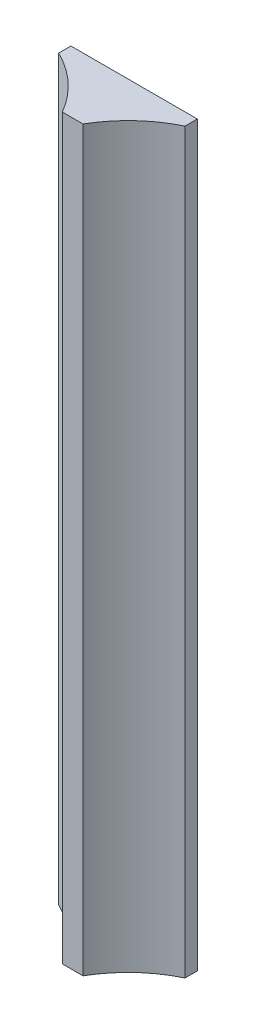
ISO-10303-21;
HEADER;
FILE_DESCRIPTION(('STEP AP214'),'2;1');
FILE_NAME('part.step','',(''),(''),'','','');
FILE_SCHEMA(('AUTOMOTIVE_DESIGN { 1 0 10303 214 1 1 1 1 }'));
ENDSEC;
DATA;
#1=APPLICATION_CONTEXT('core data for automotive mechanical design processes');
#2=APPLICATION_PROTOCOL_DEFINITION('international standard','automotive_design',2000,#1);
#3=PRODUCT_CONTEXT('',#1,'mechanical');
#4=PRODUCT('Part','Part','',(#3));
#5=PRODUCT_RELATED_PRODUCT_CATEGORY('part','',(#4));
#6=PRODUCT_DEFINITION_FORMATION('','',#4);
#7=PRODUCT_DEFINITION_CONTEXT('part definition',#1,'design');
#8=PRODUCT_DEFINITION('design','',#6,#7);
#9=PRODUCT_DEFINITION_SHAPE('','',#8);
#10=(LENGTH_UNIT() NAMED_UNIT(*) SI_UNIT(.MILLI.,.METRE.));
#11=(NAMED_UNIT(*) PLANE_ANGLE_UNIT() SI_UNIT($,.RADIAN.));
#12=(NAMED_UNIT(*) SI_UNIT($,.STERADIAN.) SOLID_ANGLE_UNIT());
#13=UNCERTAINTY_MEASURE_WITH_UNIT(LENGTH_MEASURE(1.E-05),#10,'distance_accuracy_value','');
#14=(GEOMETRIC_REPRESENTATION_CONTEXT(3) GLOBAL_UNCERTAINTY_ASSIGNED_CONTEXT((#13)) GLOBAL_UNIT_ASSIGNED_CONTEXT((#10,
#11,#12)) REPRESENTATION_CONTEXT('',''));
#15=CARTESIAN_POINT('',(0.,0.,0.));
#16=DIRECTION('',(0.,0.,1.));
#17=DIRECTION('',(1.,0.,0.));
#18=AXIS2_PLACEMENT_3D('',#15,#16,#17);
#19=CARTESIAN_POINT('',(-9.5,30.,5.));
#20=DIRECTION('',(0.,-1.,0.));
#21=DIRECTION('',(0.,0.,-1.));
#22=AXIS2_PLACEMENT_3D('',#19,#20,#21);
#23=CYLINDRICAL_SURFACE('',#22,10.);
#24=CARTESIAN_POINT('',(-9.5,-30.,5.));
#25=DIRECTION('',(0.,-1.,0.));
#26=DIRECTION('',(0.,0.,-1.));
#27=AXIS2_PLACEMENT_3D('',#24,#25,#26);
#28=CIRCLE('',#27,10.);
#29=CARTESIAN_POINT('',(-5.14110105645933,-30.,-4.));
#30=VERTEX_POINT('',#29);
#31=CARTESIAN_POINT('',(-0.839745962155612,-30.,0.));
#32=VERTEX_POINT('',#31);
#33=EDGE_CURVE('E128',#30,#32,#28,.T.);
#34=ORIENTED_EDGE('',*,*,#33,.T.);
#35=DIRECTION('',(0.,-1.,0.));
#36=VECTOR('',#35,1.);
#37=CARTESIAN_POINT('',(-0.839745962155612,30.,0.));
#38=LINE('',#37,#36);
#39=CARTESIAN_POINT('',(-0.839745962155612,30.,0.));
#40=VERTEX_POINT('',#39);
#41=EDGE_CURVE('E11',#40,#32,#38,.T.);
#42=ORIENTED_EDGE('',*,*,#41,.F.);
#43=CARTESIAN_POINT('',(-9.5,30.,5.));
#44=DIRECTION('',(0.,-1.,0.));
#45=DIRECTION('',(0.,0.,-1.));
#46=AXIS2_PLACEMENT_3D('',#43,#44,#45);
#47=CIRCLE('',#46,10.);
#48=CARTESIAN_POINT('',(-5.14110105645933,30.,-4.));
#49=VERTEX_POINT('',#48);
#50=EDGE_CURVE('E144',#49,#40,#47,.T.);
#51=ORIENTED_EDGE('',*,*,#50,.F.);
#52=DIRECTION('',(0.,-1.,0.));
#53=VECTOR('',#52,1.);
#54=CARTESIAN_POINT('',(-5.14110105645933,30.,-4.));
#55=LINE('',#54,#53);
#56=EDGE_CURVE('E124',#49,#30,#55,.T.);
#57=ORIENTED_EDGE('',*,*,#56,.T.);
#58=EDGE_LOOP('',(#34,#42,#51,#57));
#59=FACE_BOUND('',#58,.T.);
#60=ADVANCED_FACE('F39',(#59),#23,.F.);
#61=CARTESIAN_POINT('',(-0.839745962155612,30.,0.));
#62=DIRECTION('',(0.,0.,-1.));
#63=DIRECTION('',(-1.,0.,0.));
#64=AXIS2_PLACEMENT_3D('',#61,#62,#63);
#65=PLANE('',#64);
#66=DIRECTION('',(1.,0.,0.));
#67=VECTOR('',#66,1.);
#68=CARTESIAN_POINT('',(-0.839745962155612,-30.,0.));
#69=LINE('',#68,#67);
#70=CARTESIAN_POINT('',(0.839745962155612,-30.,0.));
#71=VERTEX_POINT('',#70);
#72=EDGE_CURVE('E132',#32,#71,#69,.T.);
#73=ORIENTED_EDGE('',*,*,#72,.T.);
#74=DIRECTION('',(0.,-1.,0.));
#75=VECTOR('',#74,1.);
#76=CARTESIAN_POINT('',(0.839745962155612,30.,0.));
#77=LINE('',#76,#75);
#78=CARTESIAN_POINT('',(0.839745962155612,30.,0.));
#79=VERTEX_POINT('',#78);
#80=EDGE_CURVE('E48',#79,#71,#77,.T.);
#81=ORIENTED_EDGE('',*,*,#80,.F.);
#82=DIRECTION('',(1.,0.,0.));
#83=VECTOR('',#82,1.);
#84=CARTESIAN_POINT('',(-0.839745962155612,30.,0.));
#85=LINE('',#84,#83);
#86=EDGE_CURVE('E93',#40,#79,#85,.T.);
#87=ORIENTED_EDGE('',*,*,#86,.F.);
#88=ORIENTED_EDGE('',*,*,#41,.T.);
#89=EDGE_LOOP('',(#73,#81,#87,#88));
#90=FACE_BOUND('',#89,.T.);
#91=ADVANCED_FACE('F172',(#90),#65,.F.);
#92=CARTESIAN_POINT('',(9.5,30.,5.));
#93=DIRECTION('',(0.,-1.,0.));
#94=DIRECTION('',(0.,0.,-1.));
#95=AXIS2_PLACEMENT_3D('',#92,#93,#94);
#96=CYLINDRICAL_SURFACE('',#95,10.);
#97=CARTESIAN_POINT('',(9.5,-30.,5.));
#98=DIRECTION('',(0.,-1.,0.));
#99=DIRECTION('',(0.,0.,-1.));
#100=AXIS2_PLACEMENT_3D('',#97,#98,#99);
#101=CIRCLE('',#100,10.);
#102=CARTESIAN_POINT('',(5.14110105645933,-30.,-4.));
#103=VERTEX_POINT('',#102);
#104=EDGE_CURVE('E135',#71,#103,#101,.T.);
#105=ORIENTED_EDGE('',*,*,#104,.T.);
#106=DIRECTION('',(0.,-1.,0.));
#107=VECTOR('',#106,1.);
#108=CARTESIAN_POINT('',(5.14110105645933,30.,-4.));
#109=LINE('',#108,#107);
#110=CARTESIAN_POINT('',(5.14110105645933,30.,-4.));
#111=VERTEX_POINT('',#110);
#112=EDGE_CURVE('E117',#111,#103,#109,.T.);
#113=ORIENTED_EDGE('',*,*,#112,.F.);
#114=CARTESIAN_POINT('',(9.5,30.,5.));
#115=DIRECTION('',(0.,-1.,0.));
#116=DIRECTION('',(0.,0.,-1.));
#117=AXIS2_PLACEMENT_3D('',#114,#115,#116);
#118=CIRCLE('',#117,10.);
#119=EDGE_CURVE('E106',#79,#111,#118,.T.);
#120=ORIENTED_EDGE('',*,*,#119,.F.);
#121=ORIENTED_EDGE('',*,*,#80,.T.);
#122=EDGE_LOOP('',(#105,#113,#120,#121));
#123=FACE_BOUND('',#122,.T.);
#124=ADVANCED_FACE('F154',(#123),#96,.F.);
#125=CARTESIAN_POINT('',(5.14110105645933,30.,-4.));
#126=DIRECTION('',(-1.,0.,0.));
#127=DIRECTION('',(0.,0.,1.));
#128=AXIS2_PLACEMENT_3D('',#125,#126,#127);
#129=PLANE('',#128);
#130=DIRECTION('',(0.,0.,-1.));
#131=VECTOR('',#130,1.);
#132=CARTESIAN_POINT('',(5.14110105645933,-30.,-4.));
#133=LINE('',#132,#131);
#134=CARTESIAN_POINT('',(5.14110105645933,-30.,-5.));
#135=VERTEX_POINT('',#134);
#136=EDGE_CURVE('E115',#103,#135,#133,.T.);
#137=ORIENTED_EDGE('',*,*,#136,.T.);
#138=DIRECTION('',(0.,-1.,0.));
#139=VECTOR('',#138,1.);
#140=CARTESIAN_POINT('',(5.14110105645933,30.,-5.));
#141=LINE('',#140,#139);
#142=CARTESIAN_POINT('',(5.14110105645933,30.,-5.));
#143=VERTEX_POINT('',#142);
#144=EDGE_CURVE('E112',#143,#135,#141,.T.);
#145=ORIENTED_EDGE('',*,*,#144,.F.);
#146=DIRECTION('',(0.,0.,-1.));
#147=VECTOR('',#146,1.);
#148=CARTESIAN_POINT('',(5.14110105645933,30.,-4.));
#149=LINE('',#148,#147);
#150=EDGE_CURVE('E100',#111,#143,#149,.T.);
#151=ORIENTED_EDGE('',*,*,#150,.F.);
#152=ORIENTED_EDGE('',*,*,#112,.T.);
#153=EDGE_LOOP('',(#137,#145,#151,#152));
#154=FACE_BOUND('',#153,.T.);
#155=ADVANCED_FACE('F113',(#154),#129,.F.);
#156=CARTESIAN_POINT('',(5.14110105645933,30.,-5.));
#157=DIRECTION('',(0.,0.,1.));
#158=DIRECTION('',(1.,0.,0.));
#159=AXIS2_PLACEMENT_3D('',#156,#157,#158);
#160=PLANE('',#159);
#161=DIRECTION('',(-1.,0.,0.));
#162=VECTOR('',#161,1.);
#163=CARTESIAN_POINT('',(5.14110105645933,-30.,-5.));
#164=LINE('',#163,#162);
#165=CARTESIAN_POINT('',(-5.14110105645933,-30.,-5.));
#166=VERTEX_POINT('',#165);
#167=EDGE_CURVE('E79',#135,#166,#164,.T.);
#168=ORIENTED_EDGE('',*,*,#167,.T.);
#169=DIRECTION('',(0.,-1.,0.));
#170=VECTOR('',#169,1.);
#171=CARTESIAN_POINT('',(-5.14110105645933,30.,-5.));
#172=LINE('',#171,#170);
#173=CARTESIAN_POINT('',(-5.14110105645933,30.,-5.));
#174=VERTEX_POINT('',#173);
#175=EDGE_CURVE('E118',#174,#166,#172,.T.);
#176=ORIENTED_EDGE('',*,*,#175,.F.);
#177=DIRECTION('',(-1.,0.,0.));
#178=VECTOR('',#177,1.);
#179=CARTESIAN_POINT('',(5.14110105645933,30.,-5.));
#180=LINE('',#179,#178);
#181=EDGE_CURVE('E104',#143,#174,#180,.T.);
#182=ORIENTED_EDGE('',*,*,#181,.F.);
#183=ORIENTED_EDGE('',*,*,#144,.T.);
#184=EDGE_LOOP('',(#168,#176,#182,#183));
#185=FACE_BOUND('',#184,.T.);
#186=ADVANCED_FACE('F120',(#185),#160,.F.);
#187=CARTESIAN_POINT('',(-5.14110105645933,30.,-5.));
#188=DIRECTION('',(1.,0.,0.));
#189=DIRECTION('',(0.,0.,-1.));
#190=AXIS2_PLACEMENT_3D('',#187,#188,#189);
#191=PLANE('',#190);
#192=DIRECTION('',(0.,0.,1.));
#193=VECTOR('',#192,1.);
#194=CARTESIAN_POINT('',(-5.14110105645933,-30.,-5.));
#195=LINE('',#194,#193);
#196=EDGE_CURVE('E85',#166,#30,#195,.T.);
#197=ORIENTED_EDGE('',*,*,#196,.T.);
#198=ORIENTED_EDGE('',*,*,#56,.F.);
#199=DIRECTION('',(0.,0.,1.));
#200=VECTOR('',#199,1.);
#201=CARTESIAN_POINT('',(-5.14110105645933,30.,-5.));
#202=LINE('',#201,#200);
#203=EDGE_CURVE('E56',#174,#49,#202,.T.);
#204=ORIENTED_EDGE('',*,*,#203,.F.);
#205=ORIENTED_EDGE('',*,*,#175,.T.);
#206=EDGE_LOOP('',(#197,#198,#204,#205));
#207=FACE_BOUND('',#206,.T.);
#208=ADVANCED_FACE('F161',(#207),#191,.F.);
#209=CARTESIAN_POINT('',(-9.5,30.,5.));
#210=DIRECTION('',(0.,-1.,0.));
#211=DIRECTION('',(0.,0.,-1.));
#212=AXIS2_PLACEMENT_3D('',#209,#210,#211);
#213=PLANE('',#212);
#214=ORIENTED_EDGE('',*,*,#50,.T.);
#215=ORIENTED_EDGE('',*,*,#86,.T.);
#216=ORIENTED_EDGE('',*,*,#119,.T.);
#217=ORIENTED_EDGE('',*,*,#150,.T.);
#218=ORIENTED_EDGE('',*,*,#181,.T.);
#219=ORIENTED_EDGE('',*,*,#203,.T.);
#220=EDGE_LOOP('',(#214,#215,#216,#217,#218,#219));
#221=FACE_BOUND('',#220,.T.);
#222=ADVANCED_FACE('F102',(#221),#213,.F.);
#223=CARTESIAN_POINT('',(-9.5,-30.,5.));
#224=DIRECTION('',(0.,-1.,0.));
#225=DIRECTION('',(0.,0.,-1.));
#226=AXIS2_PLACEMENT_3D('',#223,#224,#225);
#227=PLANE('',#226);
#228=ORIENTED_EDGE('',*,*,#33,.F.);
#229=ORIENTED_EDGE('',*,*,#196,.F.);
#230=ORIENTED_EDGE('',*,*,#167,.F.);
#231=ORIENTED_EDGE('',*,*,#136,.F.);
#232=ORIENTED_EDGE('',*,*,#104,.F.);
#233=ORIENTED_EDGE('',*,*,#72,.F.);
#234=EDGE_LOOP('',(#228,#229,#230,#231,#232,#233));
#235=FACE_BOUND('',#234,.T.);
#236=ADVANCED_FACE('F157',(#235),#227,.T.);
#237=CLOSED_SHELL('',(#60,#91,#124,#155,#186,#208,#222,#236));
#238=MANIFOLD_SOLID_BREP('B2',#237);
#239=ADVANCED_BREP_SHAPE_REPRESENTATION('',(#18,#238),#14);
#240=SHAPE_DEFINITION_REPRESENTATION(#9,#239);
ENDSEC;
END-ISO-10303-21;
